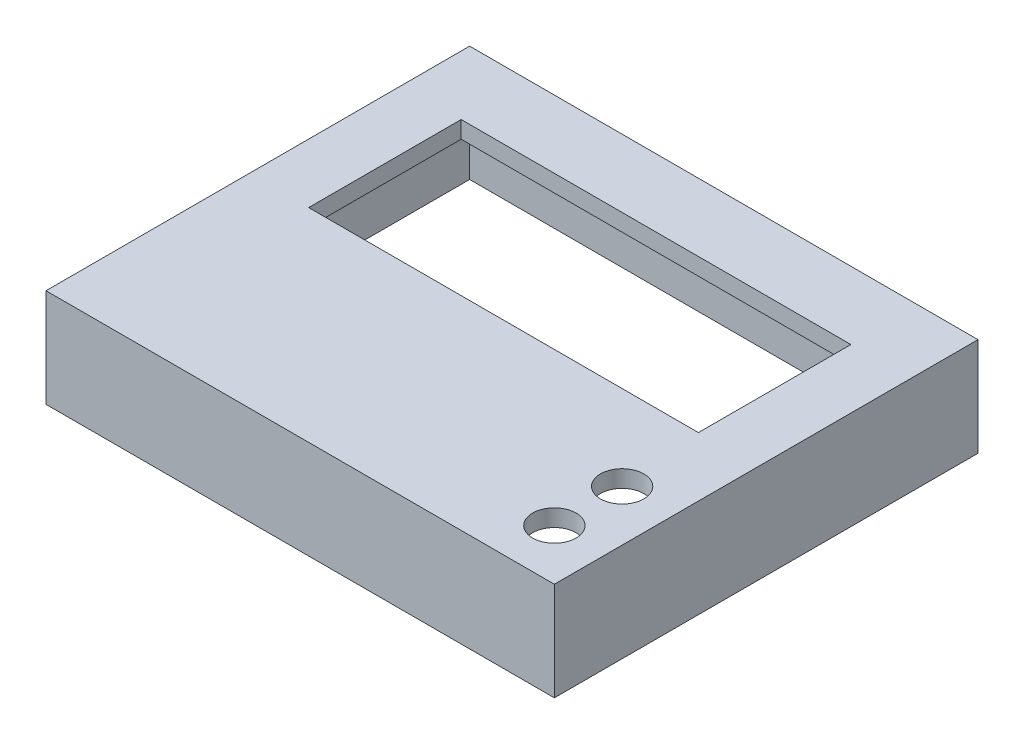
ISO-10303-21;
HEADER;
FILE_DESCRIPTION(('STEP AP214'),'2;1');
FILE_NAME('part.step','',(''),(''),'','','');
FILE_SCHEMA(('AUTOMOTIVE_DESIGN { 1 0 10303 214 1 1 1 1 }'));
ENDSEC;
DATA;
#1=APPLICATION_CONTEXT('core data for automotive mechanical design processes');
#2=APPLICATION_PROTOCOL_DEFINITION('international standard','automotive_design',2000,#1);
#3=PRODUCT_CONTEXT('',#1,'mechanical');
#4=PRODUCT('Part','Part','',(#3));
#5=PRODUCT_RELATED_PRODUCT_CATEGORY('part','',(#4));
#6=PRODUCT_DEFINITION_FORMATION('','',#4);
#7=PRODUCT_DEFINITION_CONTEXT('part definition',#1,'design');
#8=PRODUCT_DEFINITION('design','',#6,#7);
#9=PRODUCT_DEFINITION_SHAPE('','',#8);
#10=(LENGTH_UNIT() NAMED_UNIT(*) SI_UNIT(.MILLI.,.METRE.));
#11=(NAMED_UNIT(*) PLANE_ANGLE_UNIT() SI_UNIT($,.RADIAN.));
#12=(NAMED_UNIT(*) SI_UNIT($,.STERADIAN.) SOLID_ANGLE_UNIT());
#13=UNCERTAINTY_MEASURE_WITH_UNIT(LENGTH_MEASURE(1.E-05),#10,'distance_accuracy_value','');
#14=(GEOMETRIC_REPRESENTATION_CONTEXT(3) GLOBAL_UNCERTAINTY_ASSIGNED_CONTEXT((#13)) GLOBAL_UNIT_ASSIGNED_CONTEXT((#10,
#11,#12)) REPRESENTATION_CONTEXT('',''));
#15=CARTESIAN_POINT('',(0.,0.,0.));
#16=DIRECTION('',(0.,0.,1.));
#17=DIRECTION('',(1.,0.,0.));
#18=AXIS2_PLACEMENT_3D('',#15,#16,#17);
#19=CARTESIAN_POINT('',(0.,3.2,0.));
#20=DIRECTION('',(0.,-1.,0.));
#21=DIRECTION('',(0.,0.,-1.));
#22=AXIS2_PLACEMENT_3D('',#19,#20,#21);
#23=PLANE('',#22);
#24=CARTESIAN_POINT('',(38.1,3.2,42.8625));
#25=DIRECTION('',(0.,1.,0.));
#26=DIRECTION('',(0.,0.,1.));
#27=AXIS2_PLACEMENT_3D('',#24,#25,#26);
#28=CIRCLE('',#27,4.064);
#29=CARTESIAN_POINT('',(38.1,3.2,46.9265));
#30=VERTEX_POINT('',#29);
#31=EDGE_CURVE('E248',#30,#30,#28,.T.);
#32=ORIENTED_EDGE('',*,*,#31,.F.);
#33=EDGE_LOOP('',(#32));
#34=FACE_BOUND('',#33,.T.);
#35=CARTESIAN_POINT('',(38.1,3.2,30.1625));
#36=DIRECTION('',(0.,1.,0.));
#37=DIRECTION('',(0.,0.,1.));
#38=AXIS2_PLACEMENT_3D('',#35,#36,#37);
#39=CIRCLE('',#38,4.064);
#40=CARTESIAN_POINT('',(38.1,3.2,34.2265));
#41=VERTEX_POINT('',#40);
#42=EDGE_CURVE('E241',#41,#41,#39,.T.);
#43=ORIENTED_EDGE('',*,*,#42,.F.);
#44=EDGE_LOOP('',(#43));
#45=FACE_BOUND('',#44,.T.);
#46=DIRECTION('',(0.,0.,1.));
#47=VECTOR('',#46,1.);
#48=CARTESIAN_POINT('',(-47.625,3.2,-26.9875));
#49=LINE('',#48,#47);
#50=CARTESIAN_POINT('',(-47.625,3.2,-26.9875));
#51=VERTEX_POINT('',#50);
#52=CARTESIAN_POINT('',(-47.625,3.2,52.3875));
#53=VERTEX_POINT('',#52);
#54=EDGE_CURVE('E227',#51,#53,#49,.T.);
#55=ORIENTED_EDGE('',*,*,#54,.T.);
#56=DIRECTION('',(1.,0.,0.));
#57=VECTOR('',#56,1.);
#58=CARTESIAN_POINT('',(47.625,3.2,52.3875));
#59=LINE('',#58,#57);
#60=CARTESIAN_POINT('',(47.625,3.2,52.3875));
#61=VERTEX_POINT('',#60);
#62=EDGE_CURVE('E230',#53,#61,#59,.T.);
#63=ORIENTED_EDGE('',*,*,#62,.T.);
#64=DIRECTION('',(0.,0.,-1.));
#65=VECTOR('',#64,1.);
#66=CARTESIAN_POINT('',(47.625,3.2,-26.9875));
#67=LINE('',#66,#65);
#68=CARTESIAN_POINT('',(47.625,3.2,-26.9875));
#69=VERTEX_POINT('',#68);
#70=EDGE_CURVE('E232',#61,#69,#67,.T.);
#71=ORIENTED_EDGE('',*,*,#70,.T.);
#72=DIRECTION('',(-1.,0.,0.));
#73=VECTOR('',#72,1.);
#74=CARTESIAN_POINT('',(47.625,3.2,-26.9875));
#75=LINE('',#74,#73);
#76=EDGE_CURVE('E234',#69,#51,#75,.T.);
#77=ORIENTED_EDGE('',*,*,#76,.T.);
#78=EDGE_LOOP('',(#55,#63,#71,#77));
#79=FACE_BOUND('',#78,.T.);
#80=DIRECTION('',(0.,0.,1.));
#81=VECTOR('',#80,1.);
#82=CARTESIAN_POINT('',(-36.5125,3.2,-14.2875));
#83=LINE('',#82,#81);
#84=CARTESIAN_POINT('',(-36.5125,3.2,-14.2875));
#85=VERTEX_POINT('',#84);
#86=CARTESIAN_POINT('',(-36.5125,3.2,14.2875));
#87=VERTEX_POINT('',#86);
#88=EDGE_CURVE('E197',#85,#87,#83,.T.);
#89=ORIENTED_EDGE('',*,*,#88,.F.);
#90=DIRECTION('',(-1.,0.,0.));
#91=VECTOR('',#90,1.);
#92=CARTESIAN_POINT('',(36.5125,3.2,-14.2875));
#93=LINE('',#92,#91);
#94=CARTESIAN_POINT('',(36.5125,3.2,-14.2875));
#95=VERTEX_POINT('',#94);
#96=EDGE_CURVE('E205',#95,#85,#93,.T.);
#97=ORIENTED_EDGE('',*,*,#96,.F.);
#98=DIRECTION('',(0.,0.,-1.));
#99=VECTOR('',#98,1.);
#100=CARTESIAN_POINT('',(36.5125,3.2,-14.2875));
#101=LINE('',#100,#99);
#102=CARTESIAN_POINT('',(36.5125,3.2,14.2875));
#103=VERTEX_POINT('',#102);
#104=EDGE_CURVE('E202',#103,#95,#101,.T.);
#105=ORIENTED_EDGE('',*,*,#104,.F.);
#106=DIRECTION('',(1.,0.,0.));
#107=VECTOR('',#106,1.);
#108=CARTESIAN_POINT('',(36.5125,3.2,14.2875));
#109=LINE('',#108,#107);
#110=EDGE_CURVE('E199',#87,#103,#109,.T.);
#111=ORIENTED_EDGE('',*,*,#110,.F.);
#112=EDGE_LOOP('',(#89,#97,#105,#111));
#113=FACE_BOUND('',#112,.T.);
#114=ADVANCED_FACE('F57',(#34,#45,#79,#113),#23,.F.);
#115=CARTESIAN_POINT('',(0.,0.,0.));
#116=DIRECTION('',(0.,-1.,0.));
#117=DIRECTION('',(0.,0.,-1.));
#118=AXIS2_PLACEMENT_3D('',#115,#116,#117);
#119=PLANE('',#118);
#120=CARTESIAN_POINT('',(38.1,0.,42.8625));
#121=DIRECTION('',(0.,-1.,0.));
#122=DIRECTION('',(0.,0.,-1.));
#123=AXIS2_PLACEMENT_3D('',#120,#121,#122);
#124=CIRCLE('',#123,4.064);
#125=CARTESIAN_POINT('',(38.1,0.,38.7985));
#126=VERTEX_POINT('',#125);
#127=EDGE_CURVE('E61',#126,#126,#124,.T.);
#128=ORIENTED_EDGE('',*,*,#127,.F.);
#129=EDGE_LOOP('',(#128));
#130=FACE_BOUND('',#129,.T.);
#131=CARTESIAN_POINT('',(38.1,0.,30.1625));
#132=DIRECTION('',(0.,-1.,0.));
#133=DIRECTION('',(0.,0.,-1.));
#134=AXIS2_PLACEMENT_3D('',#131,#132,#133);
#135=CIRCLE('',#134,4.064);
#136=CARTESIAN_POINT('',(38.1,0.,26.0985));
#137=VERTEX_POINT('',#136);
#138=EDGE_CURVE('E175',#137,#137,#135,.T.);
#139=ORIENTED_EDGE('',*,*,#138,.F.);
#140=EDGE_LOOP('',(#139));
#141=FACE_BOUND('',#140,.T.);
#142=DIRECTION('',(-1.,0.,0.));
#143=VECTOR('',#142,1.);
#144=CARTESIAN_POINT('',(47.625,0.,49.1875));
#145=LINE('',#144,#143);
#146=CARTESIAN_POINT('',(44.425,0.,49.1875));
#147=VERTEX_POINT('',#146);
#148=CARTESIAN_POINT('',(-44.425,0.,49.1875));
#149=VERTEX_POINT('',#148);
#150=EDGE_CURVE('E74',#147,#149,#145,.T.);
#151=ORIENTED_EDGE('',*,*,#150,.T.);
#152=DIRECTION('',(0.,0.,-1.));
#153=VECTOR('',#152,1.);
#154=CARTESIAN_POINT('',(-44.425,0.,52.3875));
#155=LINE('',#154,#153);
#156=CARTESIAN_POINT('',(-44.425,0.,-23.7875));
#157=VERTEX_POINT('',#156);
#158=EDGE_CURVE('E78',#149,#157,#155,.T.);
#159=ORIENTED_EDGE('',*,*,#158,.T.);
#160=DIRECTION('',(1.,0.,0.));
#161=VECTOR('',#160,1.);
#162=CARTESIAN_POINT('',(-47.625,0.,-23.7875));
#163=LINE('',#162,#161);
#164=CARTESIAN_POINT('',(44.425,0.,-23.7875));
#165=VERTEX_POINT('',#164);
#166=EDGE_CURVE('E177',#157,#165,#163,.T.);
#167=ORIENTED_EDGE('',*,*,#166,.T.);
#168=DIRECTION('',(0.,0.,1.));
#169=VECTOR('',#168,1.);
#170=CARTESIAN_POINT('',(44.425,0.,-26.9875));
#171=LINE('',#170,#169);
#172=EDGE_CURVE('E156',#165,#147,#171,.T.);
#173=ORIENTED_EDGE('',*,*,#172,.T.);
#174=EDGE_LOOP('',(#151,#159,#167,#173));
#175=FACE_BOUND('',#174,.T.);
#176=DIRECTION('',(-1.,0.,0.));
#177=VECTOR('',#176,1.);
#178=CARTESIAN_POINT('',(36.5125,0.,-14.2875));
#179=LINE('',#178,#177);
#180=CARTESIAN_POINT('',(36.5125,0.,-14.2875));
#181=VERTEX_POINT('',#180);
#182=CARTESIAN_POINT('',(-36.5125,0.,-14.2875));
#183=VERTEX_POINT('',#182);
#184=EDGE_CURVE('E200',#181,#183,#179,.T.);
#185=ORIENTED_EDGE('',*,*,#184,.T.);
#186=DIRECTION('',(0.,0.,1.));
#187=VECTOR('',#186,1.);
#188=CARTESIAN_POINT('',(-36.5125,0.,-14.2875));
#189=LINE('',#188,#187);
#190=CARTESIAN_POINT('',(-36.5125,0.,14.2875));
#191=VERTEX_POINT('',#190);
#192=EDGE_CURVE('E196',#183,#191,#189,.T.);
#193=ORIENTED_EDGE('',*,*,#192,.T.);
#194=DIRECTION('',(1.,0.,0.));
#195=VECTOR('',#194,1.);
#196=CARTESIAN_POINT('',(36.5125,0.,14.2875));
#197=LINE('',#196,#195);
#198=CARTESIAN_POINT('',(36.5125,0.,14.2875));
#199=VERTEX_POINT('',#198);
#200=EDGE_CURVE('E210',#191,#199,#197,.T.);
#201=ORIENTED_EDGE('',*,*,#200,.T.);
#202=DIRECTION('',(0.,0.,-1.));
#203=VECTOR('',#202,1.);
#204=CARTESIAN_POINT('',(36.5125,0.,-14.2875));
#205=LINE('',#204,#203);
#206=EDGE_CURVE('E213',#199,#181,#205,.T.);
#207=ORIENTED_EDGE('',*,*,#206,.T.);
#208=EDGE_LOOP('',(#185,#193,#201,#207));
#209=FACE_BOUND('',#208,.T.);
#210=ADVANCED_FACE('F257',(#130,#141,#175,#209),#119,.T.);
#211=CARTESIAN_POINT('',(-47.625,3.2,-26.9875));
#212=DIRECTION('',(1.,0.,0.));
#213=DIRECTION('',(0.,0.,-1.));
#214=AXIS2_PLACEMENT_3D('',#211,#212,#213);
#215=PLANE('',#214);
#216=DIRECTION('',(0.,-1.,0.));
#217=VECTOR('',#216,1.);
#218=CARTESIAN_POINT('',(-47.625,3.2,-26.9875));
#219=LINE('',#218,#217);
#220=CARTESIAN_POINT('',(-47.625,-15.24,-26.9875));
#221=VERTEX_POINT('',#220);
#222=EDGE_CURVE('E236',#51,#221,#219,.T.);
#223=ORIENTED_EDGE('',*,*,#222,.T.);
#224=DIRECTION('',(0.,0.,-1.));
#225=VECTOR('',#224,1.);
#226=CARTESIAN_POINT('',(-47.625,-15.24,52.3875));
#227=LINE('',#226,#225);
#228=CARTESIAN_POINT('',(-47.625,-15.24,52.3875));
#229=VERTEX_POINT('',#228);
#230=EDGE_CURVE('E187',#229,#221,#227,.T.);
#231=ORIENTED_EDGE('',*,*,#230,.F.);
#232=DIRECTION('',(0.,-1.,0.));
#233=VECTOR('',#232,1.);
#234=CARTESIAN_POINT('',(-47.625,3.2,52.3875));
#235=LINE('',#234,#233);
#236=EDGE_CURVE('E12',#53,#229,#235,.T.);
#237=ORIENTED_EDGE('',*,*,#236,.F.);
#238=ORIENTED_EDGE('',*,*,#54,.F.);
#239=EDGE_LOOP('',(#223,#231,#237,#238));
#240=FACE_BOUND('',#239,.T.);
#241=ADVANCED_FACE('F59',(#240),#215,.F.);
#242=CARTESIAN_POINT('',(47.625,3.2,52.3875));
#243=DIRECTION('',(0.,0.,-1.));
#244=DIRECTION('',(-1.,0.,0.));
#245=AXIS2_PLACEMENT_3D('',#242,#243,#244);
#246=PLANE('',#245);
#247=ORIENTED_EDGE('',*,*,#236,.T.);
#248=DIRECTION('',(-1.,0.,0.));
#249=VECTOR('',#248,1.);
#250=CARTESIAN_POINT('',(47.625,-15.24,52.3875));
#251=LINE('',#250,#249);
#252=CARTESIAN_POINT('',(47.625,-15.24,52.3875));
#253=VERTEX_POINT('',#252);
#254=EDGE_CURVE('E161',#253,#229,#251,.T.);
#255=ORIENTED_EDGE('',*,*,#254,.F.);
#256=DIRECTION('',(0.,-1.,0.));
#257=VECTOR('',#256,1.);
#258=CARTESIAN_POINT('',(47.625,3.2,52.3875));
#259=LINE('',#258,#257);
#260=EDGE_CURVE('E66',#61,#253,#259,.T.);
#261=ORIENTED_EDGE('',*,*,#260,.F.);
#262=ORIENTED_EDGE('',*,*,#62,.F.);
#263=EDGE_LOOP('',(#247,#255,#261,#262));
#264=FACE_BOUND('',#263,.T.);
#265=ADVANCED_FACE('F302',(#264),#246,.F.);
#266=CARTESIAN_POINT('',(47.625,3.2,-26.9875));
#267=DIRECTION('',(-1.,0.,0.));
#268=DIRECTION('',(0.,0.,1.));
#269=AXIS2_PLACEMENT_3D('',#266,#267,#268);
#270=PLANE('',#269);
#271=ORIENTED_EDGE('',*,*,#260,.T.);
#272=DIRECTION('',(0.,0.,1.));
#273=VECTOR('',#272,1.);
#274=CARTESIAN_POINT('',(47.625,-15.24,-26.9875));
#275=LINE('',#274,#273);
#276=CARTESIAN_POINT('',(47.625,-15.24,-26.9875));
#277=VERTEX_POINT('',#276);
#278=EDGE_CURVE('E193',#277,#253,#275,.T.);
#279=ORIENTED_EDGE('',*,*,#278,.F.);
#280=DIRECTION('',(0.,-1.,0.));
#281=VECTOR('',#280,1.);
#282=CARTESIAN_POINT('',(47.625,3.2,-26.9875));
#283=LINE('',#282,#281);
#284=EDGE_CURVE('E238',#69,#277,#283,.T.);
#285=ORIENTED_EDGE('',*,*,#284,.F.);
#286=ORIENTED_EDGE('',*,*,#70,.F.);
#287=EDGE_LOOP('',(#271,#279,#285,#286));
#288=FACE_BOUND('',#287,.T.);
#289=ADVANCED_FACE('F299',(#288),#270,.F.);
#290=CARTESIAN_POINT('',(47.625,3.2,-26.9875));
#291=DIRECTION('',(0.,0.,1.));
#292=DIRECTION('',(1.,0.,0.));
#293=AXIS2_PLACEMENT_3D('',#290,#291,#292);
#294=PLANE('',#293);
#295=ORIENTED_EDGE('',*,*,#284,.T.);
#296=DIRECTION('',(1.,0.,0.));
#297=VECTOR('',#296,1.);
#298=CARTESIAN_POINT('',(-47.625,-15.24,-26.9875));
#299=LINE('',#298,#297);
#300=EDGE_CURVE('E190',#221,#277,#299,.T.);
#301=ORIENTED_EDGE('',*,*,#300,.F.);
#302=ORIENTED_EDGE('',*,*,#222,.F.);
#303=ORIENTED_EDGE('',*,*,#76,.F.);
#304=EDGE_LOOP('',(#295,#301,#302,#303));
#305=FACE_BOUND('',#304,.T.);
#306=ADVANCED_FACE('F292',(#305),#294,.F.);
#307=CARTESIAN_POINT('',(-36.5125,3.2,-14.2875));
#308=DIRECTION('',(1.,0.,0.));
#309=DIRECTION('',(0.,0.,-1.));
#310=AXIS2_PLACEMENT_3D('',#307,#308,#309);
#311=PLANE('',#310);
#312=ORIENTED_EDGE('',*,*,#192,.F.);
#313=DIRECTION('',(0.,-1.,0.));
#314=VECTOR('',#313,1.);
#315=CARTESIAN_POINT('',(-36.5125,3.2,-14.2875));
#316=LINE('',#315,#314);
#317=EDGE_CURVE('E207',#85,#183,#316,.T.);
#318=ORIENTED_EDGE('',*,*,#317,.F.);
#319=ORIENTED_EDGE('',*,*,#88,.T.);
#320=DIRECTION('',(0.,-1.,0.));
#321=VECTOR('',#320,1.);
#322=CARTESIAN_POINT('',(-36.5125,3.2,14.2875));
#323=LINE('',#322,#321);
#324=EDGE_CURVE('E224',#87,#191,#323,.T.);
#325=ORIENTED_EDGE('',*,*,#324,.T.);
#326=EDGE_LOOP('',(#312,#318,#319,#325));
#327=FACE_BOUND('',#326,.T.);
#328=ADVANCED_FACE('F270',(#327),#311,.T.);
#329=CARTESIAN_POINT('',(36.5125,3.2,14.2875));
#330=DIRECTION('',(0.,0.,-1.));
#331=DIRECTION('',(-1.,0.,0.));
#332=AXIS2_PLACEMENT_3D('',#329,#330,#331);
#333=PLANE('',#332);
#334=ORIENTED_EDGE('',*,*,#200,.F.);
#335=ORIENTED_EDGE('',*,*,#324,.F.);
#336=ORIENTED_EDGE('',*,*,#110,.T.);
#337=DIRECTION('',(0.,-1.,0.));
#338=VECTOR('',#337,1.);
#339=CARTESIAN_POINT('',(36.5125,3.2,14.2875));
#340=LINE('',#339,#338);
#341=EDGE_CURVE('E222',#103,#199,#340,.T.);
#342=ORIENTED_EDGE('',*,*,#341,.T.);
#343=EDGE_LOOP('',(#334,#335,#336,#342));
#344=FACE_BOUND('',#343,.T.);
#345=ADVANCED_FACE('F272',(#344),#333,.T.);
#346=CARTESIAN_POINT('',(36.5125,3.2,-14.2875));
#347=DIRECTION('',(-1.,0.,0.));
#348=DIRECTION('',(0.,0.,1.));
#349=AXIS2_PLACEMENT_3D('',#346,#347,#348);
#350=PLANE('',#349);
#351=ORIENTED_EDGE('',*,*,#206,.F.);
#352=ORIENTED_EDGE('',*,*,#341,.F.);
#353=ORIENTED_EDGE('',*,*,#104,.T.);
#354=DIRECTION('',(0.,-1.,0.));
#355=VECTOR('',#354,1.);
#356=CARTESIAN_POINT('',(36.5125,3.2,-14.2875));
#357=LINE('',#356,#355);
#358=EDGE_CURVE('E220',#95,#181,#357,.T.);
#359=ORIENTED_EDGE('',*,*,#358,.T.);
#360=EDGE_LOOP('',(#351,#352,#353,#359));
#361=FACE_BOUND('',#360,.T.);
#362=ADVANCED_FACE('F280',(#361),#350,.T.);
#363=CARTESIAN_POINT('',(36.5125,3.2,-14.2875));
#364=DIRECTION('',(0.,0.,1.));
#365=DIRECTION('',(1.,0.,0.));
#366=AXIS2_PLACEMENT_3D('',#363,#364,#365);
#367=PLANE('',#366);
#368=ORIENTED_EDGE('',*,*,#184,.F.);
#369=ORIENTED_EDGE('',*,*,#358,.F.);
#370=ORIENTED_EDGE('',*,*,#96,.T.);
#371=ORIENTED_EDGE('',*,*,#317,.T.);
#372=EDGE_LOOP('',(#368,#369,#370,#371));
#373=FACE_BOUND('',#372,.T.);
#374=ADVANCED_FACE('F278',(#373),#367,.T.);
#375=CARTESIAN_POINT('',(0.,-15.24,0.));
#376=DIRECTION('',(0.,-1.,0.));
#377=DIRECTION('',(0.,0.,-1.));
#378=AXIS2_PLACEMENT_3D('',#375,#376,#377);
#379=PLANE('',#378);
#380=ORIENTED_EDGE('',*,*,#254,.T.);
#381=ORIENTED_EDGE('',*,*,#230,.T.);
#382=ORIENTED_EDGE('',*,*,#300,.T.);
#383=ORIENTED_EDGE('',*,*,#278,.T.);
#384=EDGE_LOOP('',(#380,#381,#382,#383));
#385=FACE_BOUND('',#384,.T.);
#386=DIRECTION('',(0.,0.,-1.));
#387=VECTOR('',#386,1.);
#388=CARTESIAN_POINT('',(-44.425,-15.24,52.3875));
#389=LINE('',#388,#387);
#390=CARTESIAN_POINT('',(-44.425,-15.24,49.1875));
#391=VERTEX_POINT('',#390);
#392=CARTESIAN_POINT('',(-44.425,-15.24,-23.7875));
#393=VERTEX_POINT('',#392);
#394=EDGE_CURVE('E155',#391,#393,#389,.T.);
#395=ORIENTED_EDGE('',*,*,#394,.F.);
#396=DIRECTION('',(-1.,0.,0.));
#397=VECTOR('',#396,1.);
#398=CARTESIAN_POINT('',(47.625,-15.24,49.1875));
#399=LINE('',#398,#397);
#400=CARTESIAN_POINT('',(44.425,-15.24,49.1875));
#401=VERTEX_POINT('',#400);
#402=EDGE_CURVE('E146',#401,#391,#399,.T.);
#403=ORIENTED_EDGE('',*,*,#402,.F.);
#404=DIRECTION('',(0.,0.,1.));
#405=VECTOR('',#404,1.);
#406=CARTESIAN_POINT('',(44.425,-15.24,-26.9875));
#407=LINE('',#406,#405);
#408=CARTESIAN_POINT('',(44.425,-15.24,-23.7875));
#409=VERTEX_POINT('',#408);
#410=EDGE_CURVE('E169',#409,#401,#407,.T.);
#411=ORIENTED_EDGE('',*,*,#410,.F.);
#412=DIRECTION('',(1.,0.,0.));
#413=VECTOR('',#412,1.);
#414=CARTESIAN_POINT('',(-47.625,-15.24,-23.7875));
#415=LINE('',#414,#413);
#416=EDGE_CURVE('E167',#393,#409,#415,.T.);
#417=ORIENTED_EDGE('',*,*,#416,.F.);
#418=EDGE_LOOP('',(#395,#403,#411,#417));
#419=FACE_BOUND('',#418,.T.);
#420=ADVANCED_FACE('F165',(#385,#419),#379,.T.);
#421=CARTESIAN_POINT('',(47.625,-15.24,49.1875));
#422=DIRECTION('',(0.,0.,-1.));
#423=DIRECTION('',(-1.,0.,0.));
#424=AXIS2_PLACEMENT_3D('',#421,#422,#423);
#425=PLANE('',#424);
#426=ORIENTED_EDGE('',*,*,#150,.F.);
#427=DIRECTION('',(0.,1.,0.));
#428=VECTOR('',#427,1.);
#429=CARTESIAN_POINT('',(44.425,-15.24,49.1875));
#430=LINE('',#429,#428);
#431=EDGE_CURVE('E151',#401,#147,#430,.T.);
#432=ORIENTED_EDGE('',*,*,#431,.F.);
#433=ORIENTED_EDGE('',*,*,#402,.T.);
#434=DIRECTION('',(0.,1.,0.));
#435=VECTOR('',#434,1.);
#436=CARTESIAN_POINT('',(-44.425,-15.24,49.1875));
#437=LINE('',#436,#435);
#438=EDGE_CURVE('E149',#391,#149,#437,.T.);
#439=ORIENTED_EDGE('',*,*,#438,.T.);
#440=EDGE_LOOP('',(#426,#432,#433,#439));
#441=FACE_BOUND('',#440,.T.);
#442=ADVANCED_FACE('F148',(#441),#425,.T.);
#443=CARTESIAN_POINT('',(-44.425,-15.24,52.3875));
#444=DIRECTION('',(1.,0.,0.));
#445=DIRECTION('',(0.,0.,-1.));
#446=AXIS2_PLACEMENT_3D('',#443,#444,#445);
#447=PLANE('',#446);
#448=ORIENTED_EDGE('',*,*,#158,.F.);
#449=ORIENTED_EDGE('',*,*,#438,.F.);
#450=ORIENTED_EDGE('',*,*,#394,.T.);
#451=DIRECTION('',(0.,1.,0.));
#452=VECTOR('',#451,1.);
#453=CARTESIAN_POINT('',(-44.425,-15.24,-23.7875));
#454=LINE('',#453,#452);
#455=EDGE_CURVE('E162',#393,#157,#454,.T.);
#456=ORIENTED_EDGE('',*,*,#455,.T.);
#457=EDGE_LOOP('',(#448,#449,#450,#456));
#458=FACE_BOUND('',#457,.T.);
#459=ADVANCED_FACE('F159',(#458),#447,.T.);
#460=CARTESIAN_POINT('',(-47.625,-15.24,-23.7875));
#461=DIRECTION('',(0.,0.,1.));
#462=DIRECTION('',(1.,0.,0.));
#463=AXIS2_PLACEMENT_3D('',#460,#461,#462);
#464=PLANE('',#463);
#465=ORIENTED_EDGE('',*,*,#166,.F.);
#466=ORIENTED_EDGE('',*,*,#455,.F.);
#467=ORIENTED_EDGE('',*,*,#416,.T.);
#468=DIRECTION('',(0.,1.,0.));
#469=VECTOR('',#468,1.);
#470=CARTESIAN_POINT('',(44.425,-15.24,-23.7875));
#471=LINE('',#470,#469);
#472=EDGE_CURVE('E181',#409,#165,#471,.T.);
#473=ORIENTED_EDGE('',*,*,#472,.T.);
#474=EDGE_LOOP('',(#465,#466,#467,#473));
#475=FACE_BOUND('',#474,.T.);
#476=ADVANCED_FACE('F328',(#475),#464,.T.);
#477=CARTESIAN_POINT('',(44.425,-15.24,-26.9875));
#478=DIRECTION('',(-1.,0.,0.));
#479=DIRECTION('',(0.,0.,1.));
#480=AXIS2_PLACEMENT_3D('',#477,#478,#479);
#481=PLANE('',#480);
#482=ORIENTED_EDGE('',*,*,#172,.F.);
#483=ORIENTED_EDGE('',*,*,#472,.F.);
#484=ORIENTED_EDGE('',*,*,#410,.T.);
#485=ORIENTED_EDGE('',*,*,#431,.T.);
#486=EDGE_LOOP('',(#482,#483,#484,#485));
#487=FACE_BOUND('',#486,.T.);
#488=ADVANCED_FACE('F331',(#487),#481,.T.);
#489=CARTESIAN_POINT('',(38.1,-15.24,30.1625));
#490=DIRECTION('',(0.,1.,0.));
#491=DIRECTION('',(0.,0.,1.));
#492=AXIS2_PLACEMENT_3D('',#489,#490,#491);
#493=CYLINDRICAL_SURFACE('',#492,4.064);
#494=ORIENTED_EDGE('',*,*,#138,.T.);
#495=EDGE_LOOP('',(#494));
#496=FACE_BOUND('',#495,.T.);
#497=ORIENTED_EDGE('',*,*,#42,.T.);
#498=EDGE_LOOP('',(#497));
#499=FACE_BOUND('',#498,.T.);
#500=ADVANCED_FACE('F335',(#496,#499),#493,.F.);
#501=CARTESIAN_POINT('',(38.1,-15.24,42.8625));
#502=DIRECTION('',(0.,1.,0.));
#503=DIRECTION('',(0.,0.,1.));
#504=AXIS2_PLACEMENT_3D('',#501,#502,#503);
#505=CYLINDRICAL_SURFACE('',#504,4.064);
#506=ORIENTED_EDGE('',*,*,#127,.T.);
#507=EDGE_LOOP('',(#506));
#508=FACE_BOUND('',#507,.T.);
#509=ORIENTED_EDGE('',*,*,#31,.T.);
#510=EDGE_LOOP('',(#509));
#511=FACE_BOUND('',#510,.T.);
#512=ADVANCED_FACE('F253',(#508,#511),#505,.F.);
#513=CLOSED_SHELL('',(#114,#210,#241,#265,#289,#306,#328,#345,#362,#374,#420,#442,#459,#476,
#488,#500,#512));
#514=MANIFOLD_SOLID_BREP('B2',#513);
#515=ADVANCED_BREP_SHAPE_REPRESENTATION('',(#18,#514),#14);
#516=SHAPE_DEFINITION_REPRESENTATION(#9,#515);
ENDSEC;
END-ISO-10303-21;
